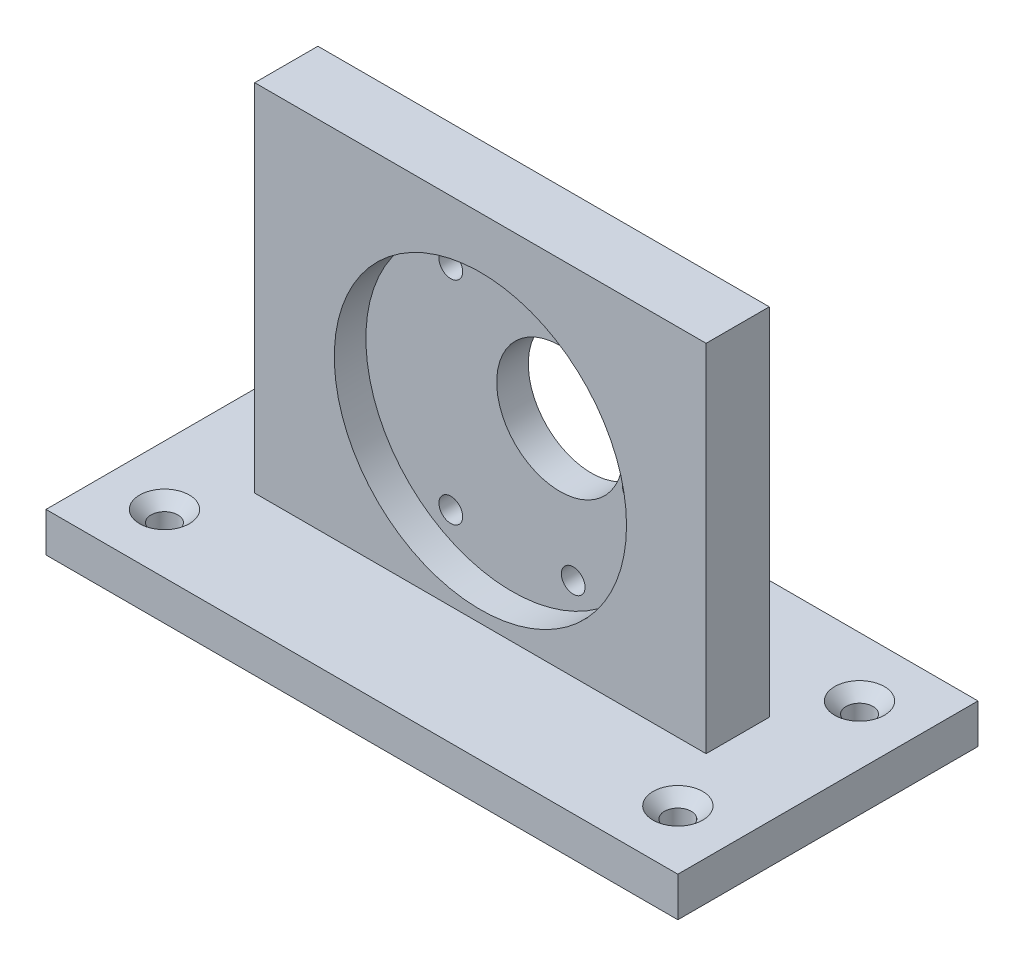
ISO-10303-21;
HEADER;
FILE_DESCRIPTION(('STEP AP214'),'2;1');
FILE_NAME('part.step','',(''),(''),'','','');
FILE_SCHEMA(('AUTOMOTIVE_DESIGN { 1 0 10303 214 1 1 1 1 }'));
ENDSEC;
DATA;
#1=APPLICATION_CONTEXT('core data for automotive mechanical design processes');
#2=APPLICATION_PROTOCOL_DEFINITION('international standard','automotive_design',2000,#1);
#3=PRODUCT_CONTEXT('',#1,'mechanical');
#4=PRODUCT('Part','Part','',(#3));
#5=PRODUCT_RELATED_PRODUCT_CATEGORY('part','',(#4));
#6=PRODUCT_DEFINITION_FORMATION('','',#4);
#7=PRODUCT_DEFINITION_CONTEXT('part definition',#1,'design');
#8=PRODUCT_DEFINITION('design','',#6,#7);
#9=PRODUCT_DEFINITION_SHAPE('','',#8);
#10=(LENGTH_UNIT() NAMED_UNIT(*) SI_UNIT(.MILLI.,.METRE.));
#11=(NAMED_UNIT(*) PLANE_ANGLE_UNIT() SI_UNIT($,.RADIAN.));
#12=(NAMED_UNIT(*) SI_UNIT($,.STERADIAN.) SOLID_ANGLE_UNIT());
#13=UNCERTAINTY_MEASURE_WITH_UNIT(LENGTH_MEASURE(1.E-05),#10,'distance_accuracy_value','');
#14=(GEOMETRIC_REPRESENTATION_CONTEXT(3) GLOBAL_UNCERTAINTY_ASSIGNED_CONTEXT((#13)) GLOBAL_UNIT_ASSIGNED_CONTEXT((#10,
#11,#12)) REPRESENTATION_CONTEXT('',''));
#15=CARTESIAN_POINT('',(0.,0.,0.));
#16=DIRECTION('',(0.,0.,1.));
#17=DIRECTION('',(1.,0.,0.));
#18=AXIS2_PLACEMENT_3D('',#15,#16,#17);
#19=CARTESIAN_POINT('',(0.,0.,0.));
#20=DIRECTION('',(0.,0.,-1.));
#21=DIRECTION('',(-1.,0.,0.));
#22=AXIS2_PLACEMENT_3D('',#19,#20,#21);
#23=PLANE('',#22);
#24=DIRECTION('',(0.,-1.,0.));
#25=VECTOR('',#24,1.);
#26=CARTESIAN_POINT('',(28.575,50.,0.));
#27=LINE('',#26,#25);
#28=CARTESIAN_POINT('',(28.575,50.,0.));
#29=VERTEX_POINT('',#28);
#30=CARTESIAN_POINT('',(28.575,5.00000000000001,0.));
#31=VERTEX_POINT('',#30);
#32=EDGE_CURVE('E351',#29,#31,#27,.T.);
#33=ORIENTED_EDGE('',*,*,#32,.T.);
#34=DIRECTION('',(-1.,0.,0.));
#35=VECTOR('',#34,1.);
#36=CARTESIAN_POINT('',(0.,5.00000000000001,0.));
#37=LINE('',#36,#35);
#38=CARTESIAN_POINT('',(-28.575,5.,0.));
#39=VERTEX_POINT('',#38);
#40=EDGE_CURVE('E12',#31,#39,#37,.T.);
#41=ORIENTED_EDGE('',*,*,#40,.T.);
#42=DIRECTION('',(0.,-1.,0.));
#43=VECTOR('',#42,1.);
#44=CARTESIAN_POINT('',(-28.575,50.,0.));
#45=LINE('',#44,#43);
#46=CARTESIAN_POINT('',(-28.575,50.,0.));
#47=VERTEX_POINT('',#46);
#48=EDGE_CURVE('E342',#47,#39,#45,.T.);
#49=ORIENTED_EDGE('',*,*,#48,.F.);
#50=DIRECTION('',(1.,0.,0.));
#51=VECTOR('',#50,1.);
#52=CARTESIAN_POINT('',(-28.575,50.,0.));
#53=LINE('',#52,#51);
#54=EDGE_CURVE('E337',#47,#29,#53,.T.);
#55=ORIENTED_EDGE('',*,*,#54,.T.);
#56=EDGE_LOOP('',(#33,#41,#49,#55));
#57=FACE_BOUND('',#56,.T.);
#58=CARTESIAN_POINT('',(7.74999999999999,38.4233937586588,0.));
#59=DIRECTION('',(0.,0.,1.));
#60=DIRECTION('',(1.,0.,0.));
#61=AXIS2_PLACEMENT_3D('',#58,#59,#60);
#62=CIRCLE('',#61,1.50000000039214);
#63=CARTESIAN_POINT('',(9.25000000039213,38.4233937586588,0.));
#64=VERTEX_POINT('',#63);
#65=EDGE_CURVE('E326',#64,#64,#62,.T.);
#66=ORIENTED_EDGE('',*,*,#65,.T.);
#67=EDGE_LOOP('',(#66));
#68=FACE_BOUND('',#67,.T.);
#69=CARTESIAN_POINT('',(6.06217782532956,28.4999999993294,0.));
#70=DIRECTION('',(0.,0.,1.));
#71=DIRECTION('',(1.,0.,0.));
#72=AXIS2_PLACEMENT_3D('',#69,#70,#71);
#73=CIRCLE('',#72,8.00000000000001);
#74=CARTESIAN_POINT('',(14.0621778253296,28.4999999993294,0.));
#75=VERTEX_POINT('',#74);
#76=EDGE_CURVE('E319',#75,#75,#73,.T.);
#77=ORIENTED_EDGE('',*,*,#76,.T.);
#78=EDGE_LOOP('',(#77));
#79=FACE_BOUND('',#78,.T.);
#80=CARTESIAN_POINT('',(15.5,25.,0.));
#81=DIRECTION('',(0.,0.,1.));
#82=DIRECTION('',(1.,0.,0.));
#83=AXIS2_PLACEMENT_3D('',#80,#81,#82);
#84=CIRCLE('',#83,1.50000000039213);
#85=CARTESIAN_POINT('',(17.0000000003921,25.,0.));
#86=VERTEX_POINT('',#85);
#87=EDGE_CURVE('E322',#86,#86,#84,.T.);
#88=ORIENTED_EDGE('',*,*,#87,.T.);
#89=EDGE_LOOP('',(#88));
#90=FACE_BOUND('',#89,.T.);
#91=CARTESIAN_POINT('',(7.75000000000001,11.5766062413412,0.));
#92=DIRECTION('',(0.,0.,1.));
#93=DIRECTION('',(1.,0.,0.));
#94=AXIS2_PLACEMENT_3D('',#91,#92,#93);
#95=CIRCLE('',#94,1.50000000039213);
#96=CARTESIAN_POINT('',(9.25000000039214,11.5766062413412,0.));
#97=VERTEX_POINT('',#96);
#98=EDGE_CURVE('E330',#97,#97,#95,.T.);
#99=ORIENTED_EDGE('',*,*,#98,.T.);
#100=EDGE_LOOP('',(#99));
#101=FACE_BOUND('',#100,.T.);
#102=CARTESIAN_POINT('',(-7.74999999999999,11.5766062413412,0.));
#103=DIRECTION('',(0.,0.,1.));
#104=DIRECTION('',(1.,0.,0.));
#105=AXIS2_PLACEMENT_3D('',#102,#103,#104);
#106=CIRCLE('',#105,1.50000000039213);
#107=CARTESIAN_POINT('',(-6.24999999960786,11.5766062413412,0.));
#108=VERTEX_POINT('',#107);
#109=EDGE_CURVE('E327',#108,#108,#106,.T.);
#110=ORIENTED_EDGE('',*,*,#109,.T.);
#111=EDGE_LOOP('',(#110));
#112=FACE_BOUND('',#111,.T.);
#113=CARTESIAN_POINT('',(-7.74999999999999,38.4233937586588,0.));
#114=DIRECTION('',(0.,0.,1.));
#115=DIRECTION('',(1.,0.,0.));
#116=AXIS2_PLACEMENT_3D('',#113,#114,#115);
#117=CIRCLE('',#116,1.50000000039213);
#118=CARTESIAN_POINT('',(-6.24999999960786,38.4233937586588,0.));
#119=VERTEX_POINT('',#118);
#120=EDGE_CURVE('E323',#119,#119,#117,.T.);
#121=ORIENTED_EDGE('',*,*,#120,.T.);
#122=EDGE_LOOP('',(#121));
#123=FACE_BOUND('',#122,.T.);
#124=DIRECTION('',(1.,0.,0.));
#125=VECTOR('',#124,1.);
#126=CARTESIAN_POINT('',(-20.564,34.977,0.));
#127=LINE('',#126,#125);
#128=CARTESIAN_POINT('',(-20.564,34.977,0.));
#129=VERTEX_POINT('',#128);
#130=CARTESIAN_POINT('',(-12.944,34.977,0.));
#131=VERTEX_POINT('',#130);
#132=EDGE_CURVE('E212',#129,#131,#127,.T.);
#133=ORIENTED_EDGE('',*,*,#132,.F.);
#134=CARTESIAN_POINT('',(-20.564,28.5,0.));
#135=DIRECTION('',(0.,0.,-1.));
#136=DIRECTION('',(-1.,0.,0.));
#137=AXIS2_PLACEMENT_3D('',#134,#135,#136);
#138=CIRCLE('',#137,6.477);
#139=CARTESIAN_POINT('',(-20.564,22.023,0.));
#140=VERTEX_POINT('',#139);
#141=EDGE_CURVE('E177',#140,#129,#138,.T.);
#142=ORIENTED_EDGE('',*,*,#141,.F.);
#143=DIRECTION('',(-1.,0.,0.));
#144=VECTOR('',#143,1.);
#145=CARTESIAN_POINT('',(-20.564,22.023,0.));
#146=LINE('',#145,#144);
#147=CARTESIAN_POINT('',(-12.944,22.023,0.));
#148=VERTEX_POINT('',#147);
#149=EDGE_CURVE('E203',#148,#140,#146,.T.);
#150=ORIENTED_EDGE('',*,*,#149,.F.);
#151=CARTESIAN_POINT('',(-12.944,28.5,0.));
#152=DIRECTION('',(0.,0.,-1.));
#153=DIRECTION('',(-1.,0.,0.));
#154=AXIS2_PLACEMENT_3D('',#151,#152,#153);
#155=CIRCLE('',#154,6.477);
#156=EDGE_CURVE('E214',#131,#148,#155,.T.);
#157=ORIENTED_EDGE('',*,*,#156,.F.);
#158=EDGE_LOOP('',(#133,#142,#150,#157));
#159=FACE_BOUND('',#158,.T.);
#160=ADVANCED_FACE('F45',(#57,#68,#79,#90,#101,#112,#123,#159),#23,.T.);
#161=CARTESIAN_POINT('',(-40.,5.,23.));
#162=DIRECTION('',(0.,-1.,0.));
#163=DIRECTION('',(1.,0.,0.));
#164=AXIS2_PLACEMENT_3D('',#161,#162,#163);
#165=PLANE('',#164);
#166=CARTESIAN_POINT('',(-32.5,5.,-7.5));
#167=DIRECTION('',(0.,1.,0.));
#168=DIRECTION('',(0.,0.,1.));
#169=AXIS2_PLACEMENT_3D('',#166,#167,#168);
#170=CIRCLE('',#169,3.15);
#171=CARTESIAN_POINT('',(-32.5,5.,-4.35));
#172=VERTEX_POINT('',#171);
#173=EDGE_CURVE('E225',#172,#172,#170,.T.);
#174=ORIENTED_EDGE('',*,*,#173,.F.);
#175=EDGE_LOOP('',(#174));
#176=FACE_BOUND('',#175,.T.);
#177=CARTESIAN_POINT('',(32.5,5.00000000000002,15.5));
#178=DIRECTION('',(0.,1.,0.));
#179=DIRECTION('',(0.,0.,1.));
#180=AXIS2_PLACEMENT_3D('',#177,#178,#179);
#181=CIRCLE('',#180,3.15);
#182=CARTESIAN_POINT('',(32.5,5.00000000000002,18.65));
#183=VERTEX_POINT('',#182);
#184=EDGE_CURVE('E243',#183,#183,#181,.T.);
#185=ORIENTED_EDGE('',*,*,#184,.F.);
#186=EDGE_LOOP('',(#185));
#187=FACE_BOUND('',#186,.T.);
#188=CARTESIAN_POINT('',(32.5,5.00000000000002,-7.5));
#189=DIRECTION('',(0.,1.,0.));
#190=DIRECTION('',(0.,0.,1.));
#191=AXIS2_PLACEMENT_3D('',#188,#189,#190);
#192=CIRCLE('',#191,3.15);
#193=CARTESIAN_POINT('',(32.5,5.00000000000002,-4.35));
#194=VERTEX_POINT('',#193);
#195=EDGE_CURVE('E252',#194,#194,#192,.T.);
#196=ORIENTED_EDGE('',*,*,#195,.F.);
#197=EDGE_LOOP('',(#196));
#198=FACE_BOUND('',#197,.T.);
#199=DIRECTION('',(0.,0.,-1.));
#200=VECTOR('',#199,1.);
#201=CARTESIAN_POINT('',(40.,5.00000000000002,23.));
#202=LINE('',#201,#200);
#203=CARTESIAN_POINT('',(40.,5.00000000000002,23.));
#204=VERTEX_POINT('',#203);
#205=CARTESIAN_POINT('',(40.,5.00000000000002,-15.));
#206=VERTEX_POINT('',#205);
#207=EDGE_CURVE('E284',#204,#206,#202,.T.);
#208=ORIENTED_EDGE('',*,*,#207,.T.);
#209=DIRECTION('',(-1.,0.,0.));
#210=VECTOR('',#209,1.);
#211=CARTESIAN_POINT('',(-40.,5.,-15.));
#212=LINE('',#211,#210);
#213=CARTESIAN_POINT('',(-40.,5.,-15.));
#214=VERTEX_POINT('',#213);
#215=EDGE_CURVE('E270',#206,#214,#212,.T.);
#216=ORIENTED_EDGE('',*,*,#215,.T.);
#217=DIRECTION('',(0.,0.,-1.));
#218=VECTOR('',#217,1.);
#219=CARTESIAN_POINT('',(-40.,5.,23.));
#220=LINE('',#219,#218);
#221=CARTESIAN_POINT('',(-40.,5.,23.));
#222=VERTEX_POINT('',#221);
#223=EDGE_CURVE('E282',#222,#214,#220,.T.);
#224=ORIENTED_EDGE('',*,*,#223,.F.);
#225=DIRECTION('',(-1.,0.,0.));
#226=VECTOR('',#225,1.);
#227=CARTESIAN_POINT('',(-40.,5.,23.));
#228=LINE('',#227,#226);
#229=EDGE_CURVE('E280',#204,#222,#228,.T.);
#230=ORIENTED_EDGE('',*,*,#229,.F.);
#231=EDGE_LOOP('',(#208,#216,#224,#230));
#232=FACE_BOUND('',#231,.T.);
#233=DIRECTION('',(0.,0.,-1.));
#234=VECTOR('',#233,1.);
#235=CARTESIAN_POINT('',(28.575,5.00000000000001,8.));
#236=LINE('',#235,#234);
#237=CARTESIAN_POINT('',(28.575,5.00000000000001,8.));
#238=VERTEX_POINT('',#237);
#239=EDGE_CURVE('E290',#238,#31,#236,.T.);
#240=ORIENTED_EDGE('',*,*,#239,.F.);
#241=DIRECTION('',(-1.,0.,0.));
#242=VECTOR('',#241,1.);
#243=CARTESIAN_POINT('',(0.,5.00000000000001,8.));
#244=LINE('',#243,#242);
#245=CARTESIAN_POINT('',(-28.575,5.,8.));
#246=VERTEX_POINT('',#245);
#247=EDGE_CURVE('E295',#238,#246,#244,.T.);
#248=ORIENTED_EDGE('',*,*,#247,.T.);
#249=DIRECTION('',(0.,0.,-1.));
#250=VECTOR('',#249,1.);
#251=CARTESIAN_POINT('',(-28.575,5.,8.));
#252=LINE('',#251,#250);
#253=EDGE_CURVE('E293',#246,#39,#252,.T.);
#254=ORIENTED_EDGE('',*,*,#253,.T.);
#255=ORIENTED_EDGE('',*,*,#40,.F.);
#256=EDGE_LOOP('',(#240,#248,#254,#255));
#257=FACE_BOUND('',#256,.T.);
#258=CARTESIAN_POINT('',(-32.5,5.,15.5));
#259=DIRECTION('',(0.,1.,0.));
#260=DIRECTION('',(0.,0.,1.));
#261=AXIS2_PLACEMENT_3D('',#258,#259,#260);
#262=CIRCLE('',#261,3.15);
#263=CARTESIAN_POINT('',(-32.5,5.,18.65));
#264=VERTEX_POINT('',#263);
#265=EDGE_CURVE('E234',#264,#264,#262,.T.);
#266=ORIENTED_EDGE('',*,*,#265,.F.);
#267=EDGE_LOOP('',(#266));
#268=FACE_BOUND('',#267,.T.);
#269=ADVANCED_FACE('F395',(#176,#187,#198,#232,#257,#268),#165,.F.);
#270=CARTESIAN_POINT('',(-28.575,50.,8.));
#271=DIRECTION('',(1.,0.,0.));
#272=DIRECTION('',(0.,1.,0.));
#273=AXIS2_PLACEMENT_3D('',#270,#271,#272);
#274=PLANE('',#273);
#275=ORIENTED_EDGE('',*,*,#253,.F.);
#276=DIRECTION('',(0.,-1.,0.));
#277=VECTOR('',#276,1.);
#278=CARTESIAN_POINT('',(-28.575,50.,8.));
#279=LINE('',#278,#277);
#280=CARTESIAN_POINT('',(-28.575,50.,8.));
#281=VERTEX_POINT('',#280);
#282=EDGE_CURVE('E345',#281,#246,#279,.T.);
#283=ORIENTED_EDGE('',*,*,#282,.F.);
#284=DIRECTION('',(0.,0.,-1.));
#285=VECTOR('',#284,1.);
#286=CARTESIAN_POINT('',(-28.575,50.,8.));
#287=LINE('',#286,#285);
#288=EDGE_CURVE('E53',#281,#47,#287,.T.);
#289=ORIENTED_EDGE('',*,*,#288,.T.);
#290=ORIENTED_EDGE('',*,*,#48,.T.);
#291=EDGE_LOOP('',(#275,#283,#289,#290));
#292=FACE_BOUND('',#291,.T.);
#293=ADVANCED_FACE('F394',(#292),#274,.F.);
#294=CARTESIAN_POINT('',(28.575,50.,8.));
#295=DIRECTION('',(1.,0.,0.));
#296=DIRECTION('',(0.,1.,0.));
#297=AXIS2_PLACEMENT_3D('',#294,#295,#296);
#298=PLANE('',#297);
#299=DIRECTION('',(0.,-1.,0.));
#300=VECTOR('',#299,1.);
#301=CARTESIAN_POINT('',(28.575,50.,8.));
#302=LINE('',#301,#300);
#303=CARTESIAN_POINT('',(28.575,50.,8.));
#304=VERTEX_POINT('',#303);
#305=EDGE_CURVE('E341',#304,#238,#302,.T.);
#306=ORIENTED_EDGE('',*,*,#305,.T.);
#307=ORIENTED_EDGE('',*,*,#239,.T.);
#308=ORIENTED_EDGE('',*,*,#32,.F.);
#309=DIRECTION('',(0.,0.,-1.));
#310=VECTOR('',#309,1.);
#311=CARTESIAN_POINT('',(28.575,50.,8.));
#312=LINE('',#311,#310);
#313=EDGE_CURVE('E348',#304,#29,#312,.T.);
#314=ORIENTED_EDGE('',*,*,#313,.F.);
#315=EDGE_LOOP('',(#306,#307,#308,#314));
#316=FACE_BOUND('',#315,.T.);
#317=ADVANCED_FACE('F380',(#316),#298,.T.);
#318=CARTESIAN_POINT('',(0.,0.,8.));
#319=DIRECTION('',(0.,0.,-1.));
#320=DIRECTION('',(-1.,0.,0.));
#321=AXIS2_PLACEMENT_3D('',#318,#319,#320);
#322=PLANE('',#321);
#323=CARTESIAN_POINT('',(0.,25.,8.));
#324=DIRECTION('',(0.,0.,1.));
#325=DIRECTION('',(1.,0.,0.));
#326=AXIS2_PLACEMENT_3D('',#323,#324,#325);
#327=CIRCLE('',#326,18.5);
#328=CARTESIAN_POINT('',(18.5,25.,8.));
#329=VERTEX_POINT('',#328);
#330=EDGE_CURVE('E297',#329,#329,#327,.T.);
#331=ORIENTED_EDGE('',*,*,#330,.F.);
#332=EDGE_LOOP('',(#331));
#333=FACE_BOUND('',#332,.T.);
#334=ORIENTED_EDGE('',*,*,#247,.F.);
#335=ORIENTED_EDGE('',*,*,#305,.F.);
#336=DIRECTION('',(1.,0.,0.));
#337=VECTOR('',#336,1.);
#338=CARTESIAN_POINT('',(-28.575,50.,8.));
#339=LINE('',#338,#337);
#340=EDGE_CURVE('E338',#281,#304,#339,.T.);
#341=ORIENTED_EDGE('',*,*,#340,.F.);
#342=ORIENTED_EDGE('',*,*,#282,.T.);
#343=EDGE_LOOP('',(#334,#335,#341,#342));
#344=FACE_BOUND('',#343,.T.);
#345=ADVANCED_FACE('F376',(#333,#344),#322,.F.);
#346=CARTESIAN_POINT('',(7.74999999999999,38.4233937586588,10.));
#347=DIRECTION('',(0.,0.,-1.));
#348=DIRECTION('',(-1.,0.,0.));
#349=AXIS2_PLACEMENT_3D('',#346,#347,#348);
#350=CYLINDRICAL_SURFACE('',#349,1.50000000039214);
#351=ORIENTED_EDGE('',*,*,#65,.F.);
#352=EDGE_LOOP('',(#351));
#353=FACE_BOUND('',#352,.T.);
#354=CARTESIAN_POINT('',(7.74999999999999,38.4233937586588,4.));
#355=DIRECTION('',(0.,0.,1.));
#356=DIRECTION('',(1.,0.,0.));
#357=AXIS2_PLACEMENT_3D('',#354,#355,#356);
#358=CIRCLE('',#357,1.50000000039214);
#359=CARTESIAN_POINT('',(9.25000000039213,38.4233937586588,4.));
#360=VERTEX_POINT('',#359);
#361=EDGE_CURVE('E316',#360,#360,#358,.T.);
#362=ORIENTED_EDGE('',*,*,#361,.T.);
#363=EDGE_LOOP('',(#362));
#364=FACE_BOUND('',#363,.T.);
#365=ADVANCED_FACE('F379',(#353,#364),#350,.F.);
#366=CARTESIAN_POINT('',(6.06217782532956,28.4999999993294,10.));
#367=DIRECTION('',(0.,0.,-1.));
#368=DIRECTION('',(-1.,0.,0.));
#369=AXIS2_PLACEMENT_3D('',#366,#367,#368);
#370=CYLINDRICAL_SURFACE('',#369,8.00000000000001);
#371=ORIENTED_EDGE('',*,*,#76,.F.);
#372=EDGE_LOOP('',(#371));
#373=FACE_BOUND('',#372,.T.);
#374=CARTESIAN_POINT('',(6.06217782532956,28.4999999993294,4.));
#375=DIRECTION('',(0.,0.,1.));
#376=DIRECTION('',(1.,0.,0.));
#377=AXIS2_PLACEMENT_3D('',#374,#375,#376);
#378=CIRCLE('',#377,8.00000000000001);
#379=CARTESIAN_POINT('',(14.0621778253296,28.4999999993294,4.));
#380=VERTEX_POINT('',#379);
#381=EDGE_CURVE('E313',#380,#380,#378,.T.);
#382=ORIENTED_EDGE('',*,*,#381,.T.);
#383=EDGE_LOOP('',(#382));
#384=FACE_BOUND('',#383,.T.);
#385=ADVANCED_FACE('F496',(#373,#384),#370,.F.);
#386=CARTESIAN_POINT('',(15.5,25.,10.));
#387=DIRECTION('',(0.,0.,-1.));
#388=DIRECTION('',(-1.,0.,0.));
#389=AXIS2_PLACEMENT_3D('',#386,#387,#388);
#390=CYLINDRICAL_SURFACE('',#389,1.50000000039213);
#391=ORIENTED_EDGE('',*,*,#87,.F.);
#392=EDGE_LOOP('',(#391));
#393=FACE_BOUND('',#392,.T.);
#394=CARTESIAN_POINT('',(15.5,25.,4.));
#395=DIRECTION('',(0.,0.,1.));
#396=DIRECTION('',(1.,0.,0.));
#397=AXIS2_PLACEMENT_3D('',#394,#395,#396);
#398=CIRCLE('',#397,1.50000000039213);
#399=CARTESIAN_POINT('',(17.0000000003921,25.,4.));
#400=VERTEX_POINT('',#399);
#401=EDGE_CURVE('E310',#400,#400,#398,.T.);
#402=ORIENTED_EDGE('',*,*,#401,.T.);
#403=EDGE_LOOP('',(#402));
#404=FACE_BOUND('',#403,.T.);
#405=ADVANCED_FACE('F499',(#393,#404),#390,.F.);
#406=CARTESIAN_POINT('',(7.75000000000001,11.5766062413412,10.));
#407=DIRECTION('',(0.,0.,-1.));
#408=DIRECTION('',(-1.,0.,0.));
#409=AXIS2_PLACEMENT_3D('',#406,#407,#408);
#410=CYLINDRICAL_SURFACE('',#409,1.50000000039213);
#411=ORIENTED_EDGE('',*,*,#98,.F.);
#412=EDGE_LOOP('',(#411));
#413=FACE_BOUND('',#412,.T.);
#414=CARTESIAN_POINT('',(7.75000000000001,11.5766062413412,4.));
#415=DIRECTION('',(0.,0.,1.));
#416=DIRECTION('',(1.,0.,0.));
#417=AXIS2_PLACEMENT_3D('',#414,#415,#416);
#418=CIRCLE('',#417,1.50000000039213);
#419=CARTESIAN_POINT('',(9.25000000039214,11.5766062413412,4.));
#420=VERTEX_POINT('',#419);
#421=EDGE_CURVE('E307',#420,#420,#418,.T.);
#422=ORIENTED_EDGE('',*,*,#421,.T.);
#423=EDGE_LOOP('',(#422));
#424=FACE_BOUND('',#423,.T.);
#425=ADVANCED_FACE('F507',(#413,#424),#410,.F.);
#426=CARTESIAN_POINT('',(-7.74999999999999,11.5766062413412,10.));
#427=DIRECTION('',(0.,0.,-1.));
#428=DIRECTION('',(-1.,0.,0.));
#429=AXIS2_PLACEMENT_3D('',#426,#427,#428);
#430=CYLINDRICAL_SURFACE('',#429,1.50000000039213);
#431=ORIENTED_EDGE('',*,*,#109,.F.);
#432=EDGE_LOOP('',(#431));
#433=FACE_BOUND('',#432,.T.);
#434=CARTESIAN_POINT('',(-7.74999999999999,11.5766062413412,4.));
#435=DIRECTION('',(0.,0.,1.));
#436=DIRECTION('',(1.,0.,0.));
#437=AXIS2_PLACEMENT_3D('',#434,#435,#436);
#438=CIRCLE('',#437,1.50000000039213);
#439=CARTESIAN_POINT('',(-6.24999999960786,11.5766062413412,4.));
#440=VERTEX_POINT('',#439);
#441=EDGE_CURVE('E304',#440,#440,#438,.T.);
#442=ORIENTED_EDGE('',*,*,#441,.T.);
#443=EDGE_LOOP('',(#442));
#444=FACE_BOUND('',#443,.T.);
#445=ADVANCED_FACE('F503',(#433,#444),#430,.F.);
#446=CARTESIAN_POINT('',(-7.74999999999999,38.4233937586588,10.));
#447=DIRECTION('',(0.,0.,-1.));
#448=DIRECTION('',(-1.,0.,0.));
#449=AXIS2_PLACEMENT_3D('',#446,#447,#448);
#450=CYLINDRICAL_SURFACE('',#449,1.50000000039213);
#451=ORIENTED_EDGE('',*,*,#120,.F.);
#452=EDGE_LOOP('',(#451));
#453=FACE_BOUND('',#452,.T.);
#454=CARTESIAN_POINT('',(-7.74999999999999,38.4233937586588,4.));
#455=DIRECTION('',(0.,0.,1.));
#456=DIRECTION('',(1.,0.,0.));
#457=AXIS2_PLACEMENT_3D('',#454,#455,#456);
#458=CIRCLE('',#457,1.50000000039213);
#459=CARTESIAN_POINT('',(-6.24999999960786,38.4233937586588,4.));
#460=VERTEX_POINT('',#459);
#461=EDGE_CURVE('E301',#460,#460,#458,.T.);
#462=ORIENTED_EDGE('',*,*,#461,.T.);
#463=EDGE_LOOP('',(#462));
#464=FACE_BOUND('',#463,.T.);
#465=ADVANCED_FACE('F360',(#453,#464),#450,.F.);
#466=CARTESIAN_POINT('',(-28.575,50.,8.));
#467=DIRECTION('',(0.,1.,0.));
#468=DIRECTION('',(-1.,0.,0.));
#469=AXIS2_PLACEMENT_3D('',#466,#467,#468);
#470=PLANE('',#469);
#471=ORIENTED_EDGE('',*,*,#54,.F.);
#472=ORIENTED_EDGE('',*,*,#288,.F.);
#473=ORIENTED_EDGE('',*,*,#340,.T.);
#474=ORIENTED_EDGE('',*,*,#313,.T.);
#475=EDGE_LOOP('',(#471,#472,#473,#474));
#476=FACE_BOUND('',#475,.T.);
#477=ADVANCED_FACE('F47',(#476),#470,.T.);
#478=CARTESIAN_POINT('',(0.,25.,4.));
#479=DIRECTION('',(0.,0.,1.));
#480=DIRECTION('',(1.,0.,0.));
#481=AXIS2_PLACEMENT_3D('',#478,#479,#480);
#482=CYLINDRICAL_SURFACE('',#481,18.5);
#483=CARTESIAN_POINT('',(0.,25.,4.));
#484=DIRECTION('',(0.,0.,1.));
#485=DIRECTION('',(1.,0.,0.));
#486=AXIS2_PLACEMENT_3D('',#483,#484,#485);
#487=CIRCLE('',#486,18.5);
#488=CARTESIAN_POINT('',(18.5,25.,4.));
#489=VERTEX_POINT('',#488);
#490=EDGE_CURVE('E298',#489,#489,#487,.T.);
#491=ORIENTED_EDGE('',*,*,#490,.F.);
#492=EDGE_LOOP('',(#491));
#493=FACE_BOUND('',#492,.T.);
#494=ORIENTED_EDGE('',*,*,#330,.T.);
#495=EDGE_LOOP('',(#494));
#496=FACE_BOUND('',#495,.T.);
#497=ADVANCED_FACE('F366',(#493,#496),#482,.F.);
#498=CARTESIAN_POINT('',(0.,25.,4.));
#499=DIRECTION('',(0.,0.,1.));
#500=DIRECTION('',(1.,0.,0.));
#501=AXIS2_PLACEMENT_3D('',#498,#499,#500);
#502=PLANE('',#501);
#503=ORIENTED_EDGE('',*,*,#361,.F.);
#504=EDGE_LOOP('',(#503));
#505=FACE_BOUND('',#504,.T.);
#506=ORIENTED_EDGE('',*,*,#381,.F.);
#507=EDGE_LOOP('',(#506));
#508=FACE_BOUND('',#507,.T.);
#509=ORIENTED_EDGE('',*,*,#401,.F.);
#510=EDGE_LOOP('',(#509));
#511=FACE_BOUND('',#510,.T.);
#512=ORIENTED_EDGE('',*,*,#421,.F.);
#513=EDGE_LOOP('',(#512));
#514=FACE_BOUND('',#513,.T.);
#515=ORIENTED_EDGE('',*,*,#441,.F.);
#516=EDGE_LOOP('',(#515));
#517=FACE_BOUND('',#516,.T.);
#518=ORIENTED_EDGE('',*,*,#461,.F.);
#519=EDGE_LOOP('',(#518));
#520=FACE_BOUND('',#519,.T.);
#521=ORIENTED_EDGE('',*,*,#490,.T.);
#522=EDGE_LOOP('',(#521));
#523=FACE_BOUND('',#522,.T.);
#524=ADVANCED_FACE('F362',(#505,#508,#511,#514,#517,#520,#523),#502,.T.);
#525=CARTESIAN_POINT('',(-40.,5.,23.));
#526=DIRECTION('',(1.,0.,0.));
#527=DIRECTION('',(0.,0.,-1.));
#528=AXIS2_PLACEMENT_3D('',#525,#526,#527);
#529=PLANE('',#528);
#530=ORIENTED_EDGE('',*,*,#223,.T.);
#531=DIRECTION('',(0.,-1.,0.));
#532=VECTOR('',#531,1.);
#533=CARTESIAN_POINT('',(-40.,5.,-15.));
#534=LINE('',#533,#532);
#535=CARTESIAN_POINT('',(-40.,0.,-15.));
#536=VERTEX_POINT('',#535);
#537=EDGE_CURVE('E261',#214,#536,#534,.T.);
#538=ORIENTED_EDGE('',*,*,#537,.T.);
#539=DIRECTION('',(0.,0.,-1.));
#540=VECTOR('',#539,1.);
#541=CARTESIAN_POINT('',(-40.,0.,23.));
#542=LINE('',#541,#540);
#543=CARTESIAN_POINT('',(-40.,0.,23.));
#544=VERTEX_POINT('',#543);
#545=EDGE_CURVE('E288',#544,#536,#542,.T.);
#546=ORIENTED_EDGE('',*,*,#545,.F.);
#547=DIRECTION('',(0.,-1.,0.));
#548=VECTOR('',#547,1.);
#549=CARTESIAN_POINT('',(-40.,5.,23.));
#550=LINE('',#549,#548);
#551=EDGE_CURVE('E273',#222,#544,#550,.T.);
#552=ORIENTED_EDGE('',*,*,#551,.F.);
#553=EDGE_LOOP('',(#530,#538,#546,#552));
#554=FACE_BOUND('',#553,.T.);
#555=ADVANCED_FACE('F365',(#554),#529,.F.);
#556=CARTESIAN_POINT('',(40.,5.00000000000002,23.));
#557=DIRECTION('',(-1.,0.,0.));
#558=DIRECTION('',(0.,0.,1.));
#559=AXIS2_PLACEMENT_3D('',#556,#557,#558);
#560=PLANE('',#559);
#561=DIRECTION('',(0.,0.,-1.));
#562=VECTOR('',#561,1.);
#563=CARTESIAN_POINT('',(40.,0.,23.));
#564=LINE('',#563,#562);
#565=CARTESIAN_POINT('',(40.,0.,23.));
#566=VERTEX_POINT('',#565);
#567=CARTESIAN_POINT('',(40.,0.,-15.));
#568=VERTEX_POINT('',#567);
#569=EDGE_CURVE('E286',#566,#568,#564,.T.);
#570=ORIENTED_EDGE('',*,*,#569,.T.);
#571=DIRECTION('',(0.,1.,0.));
#572=VECTOR('',#571,1.);
#573=CARTESIAN_POINT('',(40.,5.00000000000002,-15.));
#574=LINE('',#573,#572);
#575=EDGE_CURVE('E267',#568,#206,#574,.T.);
#576=ORIENTED_EDGE('',*,*,#575,.T.);
#577=ORIENTED_EDGE('',*,*,#207,.F.);
#578=DIRECTION('',(0.,1.,0.));
#579=VECTOR('',#578,1.);
#580=CARTESIAN_POINT('',(40.,5.00000000000002,23.));
#581=LINE('',#580,#579);
#582=EDGE_CURVE('E278',#566,#204,#581,.T.);
#583=ORIENTED_EDGE('',*,*,#582,.F.);
#584=EDGE_LOOP('',(#570,#576,#577,#583));
#585=FACE_BOUND('',#584,.T.);
#586=ADVANCED_FACE('F485',(#585),#560,.F.);
#587=CARTESIAN_POINT('',(0.,0.,23.));
#588=DIRECTION('',(0.,0.,1.));
#589=DIRECTION('',(1.,0.,0.));
#590=AXIS2_PLACEMENT_3D('',#587,#588,#589);
#591=PLANE('',#590);
#592=ORIENTED_EDGE('',*,*,#551,.T.);
#593=DIRECTION('',(1.,0.,0.));
#594=VECTOR('',#593,1.);
#595=CARTESIAN_POINT('',(-40.,0.,23.));
#596=LINE('',#595,#594);
#597=EDGE_CURVE('E276',#544,#566,#596,.T.);
#598=ORIENTED_EDGE('',*,*,#597,.T.);
#599=ORIENTED_EDGE('',*,*,#582,.T.);
#600=ORIENTED_EDGE('',*,*,#229,.T.);
#601=EDGE_LOOP('',(#592,#598,#599,#600));
#602=FACE_BOUND('',#601,.T.);
#603=ADVANCED_FACE('F481',(#602),#591,.T.);
#604=CARTESIAN_POINT('',(0.,0.,-15.));
#605=DIRECTION('',(0.,0.,1.));
#606=DIRECTION('',(1.,0.,0.));
#607=AXIS2_PLACEMENT_3D('',#604,#605,#606);
#608=PLANE('',#607);
#609=ORIENTED_EDGE('',*,*,#537,.F.);
#610=ORIENTED_EDGE('',*,*,#215,.F.);
#611=ORIENTED_EDGE('',*,*,#575,.F.);
#612=DIRECTION('',(1.,0.,0.));
#613=VECTOR('',#612,1.);
#614=CARTESIAN_POINT('',(-40.,0.,-15.));
#615=LINE('',#614,#613);
#616=EDGE_CURVE('E264',#536,#568,#615,.T.);
#617=ORIENTED_EDGE('',*,*,#616,.F.);
#618=EDGE_LOOP('',(#609,#610,#611,#617));
#619=FACE_BOUND('',#618,.T.);
#620=ADVANCED_FACE('F478',(#619),#608,.F.);
#621=CARTESIAN_POINT('',(-28.575,0.,8.));
#622=DIRECTION('',(0.,1.,0.));
#623=DIRECTION('',(-1.,0.,0.));
#624=AXIS2_PLACEMENT_3D('',#621,#622,#623);
#625=PLANE('',#624);
#626=CARTESIAN_POINT('',(-32.5,0.,-7.5));
#627=DIRECTION('',(0.,1.,0.));
#628=DIRECTION('',(0.,0.,1.));
#629=AXIS2_PLACEMENT_3D('',#626,#627,#628);
#630=CIRCLE('',#629,1.69999999999999);
#631=CARTESIAN_POINT('',(-32.5,0.,-5.80000000000001));
#632=VERTEX_POINT('',#631);
#633=EDGE_CURVE('E231',#632,#632,#630,.T.);
#634=ORIENTED_EDGE('',*,*,#633,.T.);
#635=EDGE_LOOP('',(#634));
#636=FACE_BOUND('',#635,.T.);
#637=CARTESIAN_POINT('',(-32.5,0.,15.5));
#638=DIRECTION('',(0.,1.,0.));
#639=DIRECTION('',(0.,0.,1.));
#640=AXIS2_PLACEMENT_3D('',#637,#638,#639);
#641=CIRCLE('',#640,1.69999999999999);
#642=CARTESIAN_POINT('',(-32.5,0.,17.2));
#643=VERTEX_POINT('',#642);
#644=EDGE_CURVE('E240',#643,#643,#641,.T.);
#645=ORIENTED_EDGE('',*,*,#644,.T.);
#646=EDGE_LOOP('',(#645));
#647=FACE_BOUND('',#646,.T.);
#648=CARTESIAN_POINT('',(32.5,0.,15.5));
#649=DIRECTION('',(0.,1.,0.));
#650=DIRECTION('',(0.,0.,1.));
#651=AXIS2_PLACEMENT_3D('',#648,#649,#650);
#652=CIRCLE('',#651,1.69999999999999);
#653=CARTESIAN_POINT('',(32.5,0.,17.2));
#654=VERTEX_POINT('',#653);
#655=EDGE_CURVE('E249',#654,#654,#652,.T.);
#656=ORIENTED_EDGE('',*,*,#655,.T.);
#657=EDGE_LOOP('',(#656));
#658=FACE_BOUND('',#657,.T.);
#659=CARTESIAN_POINT('',(32.5,0.,-7.5));
#660=DIRECTION('',(0.,1.,0.));
#661=DIRECTION('',(0.,0.,1.));
#662=AXIS2_PLACEMENT_3D('',#659,#660,#661);
#663=CIRCLE('',#662,1.69999999999999);
#664=CARTESIAN_POINT('',(32.5,0.,-5.80000000000001));
#665=VERTEX_POINT('',#664);
#666=EDGE_CURVE('E258',#665,#665,#663,.T.);
#667=ORIENTED_EDGE('',*,*,#666,.T.);
#668=EDGE_LOOP('',(#667));
#669=FACE_BOUND('',#668,.T.);
#670=ORIENTED_EDGE('',*,*,#545,.T.);
#671=ORIENTED_EDGE('',*,*,#616,.T.);
#672=ORIENTED_EDGE('',*,*,#569,.F.);
#673=ORIENTED_EDGE('',*,*,#597,.F.);
#674=EDGE_LOOP('',(#670,#671,#672,#673));
#675=FACE_BOUND('',#674,.T.);
#676=ADVANCED_FACE('F476',(#636,#647,#658,#669,#675),#625,.F.);
#677=CARTESIAN_POINT('',(32.5,5.00000000000001,-7.5));
#678=DIRECTION('',(0.,1.,0.));
#679=DIRECTION('',(0.,0.,1.));
#680=AXIS2_PLACEMENT_3D('',#677,#678,#679);
#681=CYLINDRICAL_SURFACE('',#680,1.69999999999999);
#682=ORIENTED_EDGE('',*,*,#666,.F.);
#683=EDGE_LOOP('',(#682));
#684=FACE_BOUND('',#683,.T.);
#685=CARTESIAN_POINT('',(32.5,3.55000000000001,-7.5));
#686=DIRECTION('',(0.,1.,0.));
#687=DIRECTION('',(0.,0.,1.));
#688=AXIS2_PLACEMENT_3D('',#685,#686,#687);
#689=CIRCLE('',#688,1.69999999999999);
#690=CARTESIAN_POINT('',(32.5,3.55000000000001,-5.80000000000001));
#691=VERTEX_POINT('',#690);
#692=EDGE_CURVE('E255',#691,#691,#689,.T.);
#693=ORIENTED_EDGE('',*,*,#692,.T.);
#694=EDGE_LOOP('',(#693));
#695=FACE_BOUND('',#694,.T.);
#696=ADVANCED_FACE('F472',(#684,#695),#681,.F.);
#697=CARTESIAN_POINT('',(32.5,5.00000000000002,-7.5));
#698=DIRECTION('',(0.,1.,0.));
#699=DIRECTION('',(0.,0.,1.));
#700=AXIS2_PLACEMENT_3D('',#697,#698,#699);
#701=CONICAL_SURFACE('',#700,3.15,0.78539816339745);
#702=ORIENTED_EDGE('',*,*,#692,.F.);
#703=EDGE_LOOP('',(#702));
#704=FACE_BOUND('',#703,.T.);
#705=ORIENTED_EDGE('',*,*,#195,.T.);
#706=EDGE_LOOP('',(#705));
#707=FACE_BOUND('',#706,.T.);
#708=ADVANCED_FACE('F468',(#704,#707),#701,.F.);
#709=CARTESIAN_POINT('',(32.5,5.00000000000001,15.5));
#710=DIRECTION('',(0.,1.,0.));
#711=DIRECTION('',(0.,0.,1.));
#712=AXIS2_PLACEMENT_3D('',#709,#710,#711);
#713=CYLINDRICAL_SURFACE('',#712,1.69999999999999);
#714=ORIENTED_EDGE('',*,*,#655,.F.);
#715=EDGE_LOOP('',(#714));
#716=FACE_BOUND('',#715,.T.);
#717=CARTESIAN_POINT('',(32.5,3.55000000000001,15.5));
#718=DIRECTION('',(0.,1.,0.));
#719=DIRECTION('',(0.,0.,1.));
#720=AXIS2_PLACEMENT_3D('',#717,#718,#719);
#721=CIRCLE('',#720,1.69999999999999);
#722=CARTESIAN_POINT('',(32.5,3.55000000000001,17.2));
#723=VERTEX_POINT('',#722);
#724=EDGE_CURVE('E246',#723,#723,#721,.T.);
#725=ORIENTED_EDGE('',*,*,#724,.T.);
#726=EDGE_LOOP('',(#725));
#727=FACE_BOUND('',#726,.T.);
#728=ADVANCED_FACE('F464',(#716,#727),#713,.F.);
#729=CARTESIAN_POINT('',(32.5,5.00000000000002,15.5));
#730=DIRECTION('',(0.,1.,0.));
#731=DIRECTION('',(0.,0.,1.));
#732=AXIS2_PLACEMENT_3D('',#729,#730,#731);
#733=CONICAL_SURFACE('',#732,3.15,0.78539816339745);
#734=ORIENTED_EDGE('',*,*,#724,.F.);
#735=EDGE_LOOP('',(#734));
#736=FACE_BOUND('',#735,.T.);
#737=ORIENTED_EDGE('',*,*,#184,.T.);
#738=EDGE_LOOP('',(#737));
#739=FACE_BOUND('',#738,.T.);
#740=ADVANCED_FACE('F460',(#736,#739),#733,.F.);
#741=CARTESIAN_POINT('',(-32.5,5.,15.5));
#742=DIRECTION('',(0.,1.,0.));
#743=DIRECTION('',(0.,0.,1.));
#744=AXIS2_PLACEMENT_3D('',#741,#742,#743);
#745=CYLINDRICAL_SURFACE('',#744,1.69999999999999);
#746=ORIENTED_EDGE('',*,*,#644,.F.);
#747=EDGE_LOOP('',(#746));
#748=FACE_BOUND('',#747,.T.);
#749=CARTESIAN_POINT('',(-32.5,3.54999999999999,15.5));
#750=DIRECTION('',(0.,1.,0.));
#751=DIRECTION('',(0.,0.,1.));
#752=AXIS2_PLACEMENT_3D('',#749,#750,#751);
#753=CIRCLE('',#752,1.69999999999999);
#754=CARTESIAN_POINT('',(-32.5,3.54999999999999,17.2));
#755=VERTEX_POINT('',#754);
#756=EDGE_CURVE('E237',#755,#755,#753,.T.);
#757=ORIENTED_EDGE('',*,*,#756,.T.);
#758=EDGE_LOOP('',(#757));
#759=FACE_BOUND('',#758,.T.);
#760=ADVANCED_FACE('F456',(#748,#759),#745,.F.);
#761=CARTESIAN_POINT('',(-32.5,5.,15.5));
#762=DIRECTION('',(0.,1.,0.));
#763=DIRECTION('',(0.,0.,1.));
#764=AXIS2_PLACEMENT_3D('',#761,#762,#763);
#765=CONICAL_SURFACE('',#764,3.15,0.78539816339745);
#766=ORIENTED_EDGE('',*,*,#756,.F.);
#767=EDGE_LOOP('',(#766));
#768=FACE_BOUND('',#767,.T.);
#769=ORIENTED_EDGE('',*,*,#265,.T.);
#770=EDGE_LOOP('',(#769));
#771=FACE_BOUND('',#770,.T.);
#772=ADVANCED_FACE('F452',(#768,#771),#765,.F.);
#773=CARTESIAN_POINT('',(-32.5,5.,-7.5));
#774=DIRECTION('',(0.,1.,0.));
#775=DIRECTION('',(0.,0.,1.));
#776=AXIS2_PLACEMENT_3D('',#773,#774,#775);
#777=CYLINDRICAL_SURFACE('',#776,1.69999999999999);
#778=ORIENTED_EDGE('',*,*,#633,.F.);
#779=EDGE_LOOP('',(#778));
#780=FACE_BOUND('',#779,.T.);
#781=CARTESIAN_POINT('',(-32.5,3.54999999999999,-7.5));
#782=DIRECTION('',(0.,1.,0.));
#783=DIRECTION('',(0.,0.,1.));
#784=AXIS2_PLACEMENT_3D('',#781,#782,#783);
#785=CIRCLE('',#784,1.69999999999999);
#786=CARTESIAN_POINT('',(-32.5,3.54999999999999,-5.80000000000001));
#787=VERTEX_POINT('',#786);
#788=EDGE_CURVE('E228',#787,#787,#785,.T.);
#789=ORIENTED_EDGE('',*,*,#788,.T.);
#790=EDGE_LOOP('',(#789));
#791=FACE_BOUND('',#790,.T.);
#792=ADVANCED_FACE('F448',(#780,#791),#777,.F.);
#793=CARTESIAN_POINT('',(-32.5,5.,-7.5));
#794=DIRECTION('',(0.,1.,0.));
#795=DIRECTION('',(0.,0.,1.));
#796=AXIS2_PLACEMENT_3D('',#793,#794,#795);
#797=CONICAL_SURFACE('',#796,3.15,0.78539816339745);
#798=ORIENTED_EDGE('',*,*,#788,.F.);
#799=EDGE_LOOP('',(#798));
#800=FACE_BOUND('',#799,.T.);
#801=ORIENTED_EDGE('',*,*,#173,.T.);
#802=EDGE_LOOP('',(#801));
#803=FACE_BOUND('',#802,.T.);
#804=ADVANCED_FACE('F445',(#800,#803),#797,.F.);
#805=CARTESIAN_POINT('',(-20.564,28.5,-2.54));
#806=DIRECTION('',(0.,0.,-1.));
#807=DIRECTION('',(-1.,0.,0.));
#808=AXIS2_PLACEMENT_3D('',#805,#806,#807);
#809=PLANE('',#808);
#810=CARTESIAN_POINT('',(-20.564,28.5,-2.54));
#811=DIRECTION('',(0.,0.,-1.));
#812=DIRECTION('',(-1.,0.,0.));
#813=AXIS2_PLACEMENT_3D('',#810,#811,#812);
#814=CIRCLE('',#813,6.477);
#815=CARTESIAN_POINT('',(-20.564,22.023,-2.54));
#816=VERTEX_POINT('',#815);
#817=CARTESIAN_POINT('',(-20.564,34.977,-2.54));
#818=VERTEX_POINT('',#817);
#819=EDGE_CURVE('E199',#816,#818,#814,.T.);
#820=ORIENTED_EDGE('',*,*,#819,.T.);
#821=DIRECTION('',(1.,0.,0.));
#822=VECTOR('',#821,1.);
#823=CARTESIAN_POINT('',(-20.564,34.977,-2.54));
#824=LINE('',#823,#822);
#825=CARTESIAN_POINT('',(-12.944,34.977,-2.54));
#826=VERTEX_POINT('',#825);
#827=EDGE_CURVE('E202',#818,#826,#824,.T.);
#828=ORIENTED_EDGE('',*,*,#827,.T.);
#829=CARTESIAN_POINT('',(-12.944,28.5,-2.54));
#830=DIRECTION('',(0.,0.,-1.));
#831=DIRECTION('',(-1.,0.,0.));
#832=AXIS2_PLACEMENT_3D('',#829,#830,#831);
#833=CIRCLE('',#832,6.477);
#834=CARTESIAN_POINT('',(-12.944,22.023,-2.54));
#835=VERTEX_POINT('',#834);
#836=EDGE_CURVE('E205',#826,#835,#833,.T.);
#837=ORIENTED_EDGE('',*,*,#836,.T.);
#838=DIRECTION('',(-1.,0.,0.));
#839=VECTOR('',#838,1.);
#840=CARTESIAN_POINT('',(-20.564,22.023,-2.54));
#841=LINE('',#840,#839);
#842=EDGE_CURVE('E207',#835,#816,#841,.T.);
#843=ORIENTED_EDGE('',*,*,#842,.T.);
#844=EDGE_LOOP('',(#820,#828,#837,#843));
#845=FACE_BOUND('',#844,.T.);
#846=DIRECTION('',(1.,0.,0.));
#847=VECTOR('',#846,1.);
#848=CARTESIAN_POINT('',(-20.564,33.707,-2.54));
#849=LINE('',#848,#847);
#850=CARTESIAN_POINT('',(-20.564,33.707,-2.54));
#851=VERTEX_POINT('',#850);
#852=CARTESIAN_POINT('',(-12.944,33.707,-2.54));
#853=VERTEX_POINT('',#852);
#854=EDGE_CURVE('E169',#851,#853,#849,.T.);
#855=ORIENTED_EDGE('',*,*,#854,.F.);
#856=CARTESIAN_POINT('',(-20.564,28.5,-2.54));
#857=DIRECTION('',(0.,0.,-1.));
#858=DIRECTION('',(-1.,0.,0.));
#859=AXIS2_PLACEMENT_3D('',#856,#857,#858);
#860=CIRCLE('',#859,5.207);
#861=CARTESIAN_POINT('',(-20.564,23.293,-2.54));
#862=VERTEX_POINT('',#861);
#863=EDGE_CURVE('E160',#862,#851,#860,.T.);
#864=ORIENTED_EDGE('',*,*,#863,.F.);
#865=DIRECTION('',(-1.,0.,0.));
#866=VECTOR('',#865,1.);
#867=CARTESIAN_POINT('',(-20.564,23.293,-2.54));
#868=LINE('',#867,#866);
#869=CARTESIAN_POINT('',(-12.944,23.293,-2.54));
#870=VERTEX_POINT('',#869);
#871=EDGE_CURVE('E185',#870,#862,#868,.T.);
#872=ORIENTED_EDGE('',*,*,#871,.F.);
#873=CARTESIAN_POINT('',(-12.944,28.5,-2.54));
#874=DIRECTION('',(0.,0.,-1.));
#875=DIRECTION('',(-1.,0.,0.));
#876=AXIS2_PLACEMENT_3D('',#873,#874,#875);
#877=CIRCLE('',#876,5.207);
#878=EDGE_CURVE('E183',#853,#870,#877,.T.);
#879=ORIENTED_EDGE('',*,*,#878,.F.);
#880=EDGE_LOOP('',(#855,#864,#872,#879));
#881=FACE_BOUND('',#880,.T.);
#882=ADVANCED_FACE('F181',(#845,#881),#809,.T.);
#883=CARTESIAN_POINT('',(-20.564,28.5,-2.54));
#884=DIRECTION('',(0.,0.,1.));
#885=DIRECTION('',(1.,0.,0.));
#886=AXIS2_PLACEMENT_3D('',#883,#884,#885);
#887=CYLINDRICAL_SURFACE('',#886,6.477);
#888=ORIENTED_EDGE('',*,*,#141,.T.);
#889=DIRECTION('',(0.,0.,1.));
#890=VECTOR('',#889,1.);
#891=CARTESIAN_POINT('',(-20.564,34.977,-2.54));
#892=LINE('',#891,#890);
#893=EDGE_CURVE('E223',#818,#129,#892,.T.);
#894=ORIENTED_EDGE('',*,*,#893,.F.);
#895=ORIENTED_EDGE('',*,*,#819,.F.);
#896=DIRECTION('',(0.,0.,1.));
#897=VECTOR('',#896,1.);
#898=CARTESIAN_POINT('',(-20.564,22.023,-2.54));
#899=LINE('',#898,#897);
#900=EDGE_CURVE('E209',#816,#140,#899,.T.);
#901=ORIENTED_EDGE('',*,*,#900,.T.);
#902=EDGE_LOOP('',(#888,#894,#895,#901));
#903=FACE_BOUND('',#902,.T.);
#904=ADVANCED_FACE('F429',(#903),#887,.T.);
#905=CARTESIAN_POINT('',(-20.564,34.977,-2.54));
#906=DIRECTION('',(0.,-1.,0.));
#907=DIRECTION('',(0.,0.,-1.));
#908=AXIS2_PLACEMENT_3D('',#905,#906,#907);
#909=PLANE('',#908);
#910=ORIENTED_EDGE('',*,*,#132,.T.);
#911=DIRECTION('',(0.,0.,1.));
#912=VECTOR('',#911,1.);
#913=CARTESIAN_POINT('',(-12.944,34.977,-2.54));
#914=LINE('',#913,#912);
#915=EDGE_CURVE('E220',#826,#131,#914,.T.);
#916=ORIENTED_EDGE('',*,*,#915,.F.);
#917=ORIENTED_EDGE('',*,*,#827,.F.);
#918=ORIENTED_EDGE('',*,*,#893,.T.);
#919=EDGE_LOOP('',(#910,#916,#917,#918));
#920=FACE_BOUND('',#919,.T.);
#921=ADVANCED_FACE('F420',(#920),#909,.F.);
#922=CARTESIAN_POINT('',(-12.944,28.5,-2.54));
#923=DIRECTION('',(0.,0.,1.));
#924=DIRECTION('',(1.,0.,0.));
#925=AXIS2_PLACEMENT_3D('',#922,#923,#924);
#926=CYLINDRICAL_SURFACE('',#925,6.477);
#927=ORIENTED_EDGE('',*,*,#156,.T.);
#928=DIRECTION('',(0.,0.,1.));
#929=VECTOR('',#928,1.);
#930=CARTESIAN_POINT('',(-12.944,22.023,-2.54));
#931=LINE('',#930,#929);
#932=EDGE_CURVE('E60',#835,#148,#931,.T.);
#933=ORIENTED_EDGE('',*,*,#932,.F.);
#934=ORIENTED_EDGE('',*,*,#836,.F.);
#935=ORIENTED_EDGE('',*,*,#915,.T.);
#936=EDGE_LOOP('',(#927,#933,#934,#935));
#937=FACE_BOUND('',#936,.T.);
#938=ADVANCED_FACE('F424',(#937),#926,.T.);
#939=CARTESIAN_POINT('',(-20.564,22.023,-2.54));
#940=DIRECTION('',(0.,1.,0.));
#941=DIRECTION('',(0.,0.,1.));
#942=AXIS2_PLACEMENT_3D('',#939,#940,#941);
#943=PLANE('',#942);
#944=ORIENTED_EDGE('',*,*,#149,.T.);
#945=ORIENTED_EDGE('',*,*,#900,.F.);
#946=ORIENTED_EDGE('',*,*,#842,.F.);
#947=ORIENTED_EDGE('',*,*,#932,.T.);
#948=EDGE_LOOP('',(#944,#945,#946,#947));
#949=FACE_BOUND('',#948,.T.);
#950=ADVANCED_FACE('F430',(#949),#943,.F.);
#951=CARTESIAN_POINT('',(-20.564,28.5,-2.54));
#952=DIRECTION('',(0.,0.,1.));
#953=DIRECTION('',(1.,0.,0.));
#954=AXIS2_PLACEMENT_3D('',#951,#952,#953);
#955=CYLINDRICAL_SURFACE('',#954,5.207);
#956=CARTESIAN_POINT('',(-20.564,28.5,0.));
#957=DIRECTION('',(0.,0.,-1.));
#958=DIRECTION('',(-1.,0.,0.));
#959=AXIS2_PLACEMENT_3D('',#956,#957,#958);
#960=CIRCLE('',#959,5.207);
#961=CARTESIAN_POINT('',(-20.564,23.293,0.));
#962=VERTEX_POINT('',#961);
#963=CARTESIAN_POINT('',(-20.564,33.707,0.));
#964=VERTEX_POINT('',#963);
#965=EDGE_CURVE('E68',#962,#964,#960,.T.);
#966=ORIENTED_EDGE('',*,*,#965,.F.);
#967=DIRECTION('',(0.,0.,1.));
#968=VECTOR('',#967,1.);
#969=CARTESIAN_POINT('',(-20.564,23.293,-2.54));
#970=LINE('',#969,#968);
#971=EDGE_CURVE('E165',#862,#962,#970,.T.);
#972=ORIENTED_EDGE('',*,*,#971,.F.);
#973=ORIENTED_EDGE('',*,*,#863,.T.);
#974=DIRECTION('',(0.,0.,1.));
#975=VECTOR('',#974,1.);
#976=CARTESIAN_POINT('',(-20.564,33.707,-2.54));
#977=LINE('',#976,#975);
#978=EDGE_CURVE('E163',#851,#964,#977,.T.);
#979=ORIENTED_EDGE('',*,*,#978,.T.);
#980=EDGE_LOOP('',(#966,#972,#973,#979));
#981=FACE_BOUND('',#980,.T.);
#982=ADVANCED_FACE('F162',(#981),#955,.F.);
#983=CARTESIAN_POINT('',(-20.564,33.707,-2.54));
#984=DIRECTION('',(0.,-1.,0.));
#985=DIRECTION('',(1.,0.,0.));
#986=AXIS2_PLACEMENT_3D('',#983,#984,#985);
#987=PLANE('',#986);
#988=DIRECTION('',(1.,0.,0.));
#989=VECTOR('',#988,1.);
#990=CARTESIAN_POINT('',(-20.564,33.707,0.));
#991=LINE('',#990,#989);
#992=CARTESIAN_POINT('',(-12.944,33.707,0.));
#993=VERTEX_POINT('',#992);
#994=EDGE_CURVE('E176',#964,#993,#991,.T.);
#995=ORIENTED_EDGE('',*,*,#994,.F.);
#996=ORIENTED_EDGE('',*,*,#978,.F.);
#997=ORIENTED_EDGE('',*,*,#854,.T.);
#998=DIRECTION('',(0.,0.,1.));
#999=VECTOR('',#998,1.);
#1000=CARTESIAN_POINT('',(-12.944,33.707,-2.54));
#1001=LINE('',#1000,#999);
#1002=EDGE_CURVE('E178',#853,#993,#1001,.T.);
#1003=ORIENTED_EDGE('',*,*,#1002,.T.);
#1004=EDGE_LOOP('',(#995,#996,#997,#1003));
#1005=FACE_BOUND('',#1004,.T.);
#1006=ADVANCED_FACE('F173',(#1005),#987,.T.);
#1007=CARTESIAN_POINT('',(-12.944,28.5,-2.54));
#1008=DIRECTION('',(0.,0.,1.));
#1009=DIRECTION('',(1.,0.,0.));
#1010=AXIS2_PLACEMENT_3D('',#1007,#1008,#1009);
#1011=CYLINDRICAL_SURFACE('',#1010,5.207);
#1012=CARTESIAN_POINT('',(-12.944,28.5,0.));
#1013=DIRECTION('',(0.,0.,-1.));
#1014=DIRECTION('',(-1.,0.,0.));
#1015=AXIS2_PLACEMENT_3D('',#1012,#1013,#1014);
#1016=CIRCLE('',#1015,5.207);
#1017=CARTESIAN_POINT('',(-12.944,23.293,0.));
#1018=VERTEX_POINT('',#1017);
#1019=EDGE_CURVE('E191',#993,#1018,#1016,.T.);
#1020=ORIENTED_EDGE('',*,*,#1019,.F.);
#1021=ORIENTED_EDGE('',*,*,#1002,.F.);
#1022=ORIENTED_EDGE('',*,*,#878,.T.);
#1023=DIRECTION('',(0.,0.,1.));
#1024=VECTOR('',#1023,1.);
#1025=CARTESIAN_POINT('',(-12.944,23.293,-2.54));
#1026=LINE('',#1025,#1024);
#1027=EDGE_CURVE('E195',#870,#1018,#1026,.T.);
#1028=ORIENTED_EDGE('',*,*,#1027,.T.);
#1029=EDGE_LOOP('',(#1020,#1021,#1022,#1028));
#1030=FACE_BOUND('',#1029,.T.);
#1031=ADVANCED_FACE('F663',(#1030),#1011,.F.);
#1032=CARTESIAN_POINT('',(-20.564,23.293,-2.54));
#1033=DIRECTION('',(0.,1.,0.));
#1034=DIRECTION('',(-1.,0.,0.));
#1035=AXIS2_PLACEMENT_3D('',#1032,#1033,#1034);
#1036=PLANE('',#1035);
#1037=DIRECTION('',(-1.,0.,0.));
#1038=VECTOR('',#1037,1.);
#1039=CARTESIAN_POINT('',(-20.564,23.293,0.));
#1040=LINE('',#1039,#1038);
#1041=EDGE_CURVE('E170',#1018,#962,#1040,.T.);
#1042=ORIENTED_EDGE('',*,*,#1041,.F.);
#1043=ORIENTED_EDGE('',*,*,#1027,.F.);
#1044=ORIENTED_EDGE('',*,*,#871,.T.);
#1045=ORIENTED_EDGE('',*,*,#971,.T.);
#1046=EDGE_LOOP('',(#1042,#1043,#1044,#1045));
#1047=FACE_BOUND('',#1046,.T.);
#1048=ADVANCED_FACE('F519',(#1047),#1036,.T.);
#1049=ORIENTED_EDGE('',*,*,#965,.T.);
#1050=ORIENTED_EDGE('',*,*,#994,.T.);
#1051=ORIENTED_EDGE('',*,*,#1019,.T.);
#1052=ORIENTED_EDGE('',*,*,#1041,.T.);
#1053=EDGE_LOOP('',(#1049,#1050,#1051,#1052));
#1054=FACE_BOUND('',#1053,.T.);
#1055=ADVANCED_FACE('F401',(#1054),#23,.T.);
#1056=CLOSED_SHELL('',(#160,#269,#293,#317,#345,#365,#385,#405,#425,#445,#465,#477,#497,#524,
#555,#586,#603,#620,#676,#696,#708,#728,#740,#760,#772,#792,#804,#882,#904,#921,#938,#950,#982,
#1006,#1031,#1048,#1055));
#1057=MANIFOLD_SOLID_BREP('B2',#1056);
#1058=ADVANCED_BREP_SHAPE_REPRESENTATION('',(#18,#1057),#14);
#1059=SHAPE_DEFINITION_REPRESENTATION(#9,#1058);
ENDSEC;
END-ISO-10303-21;
